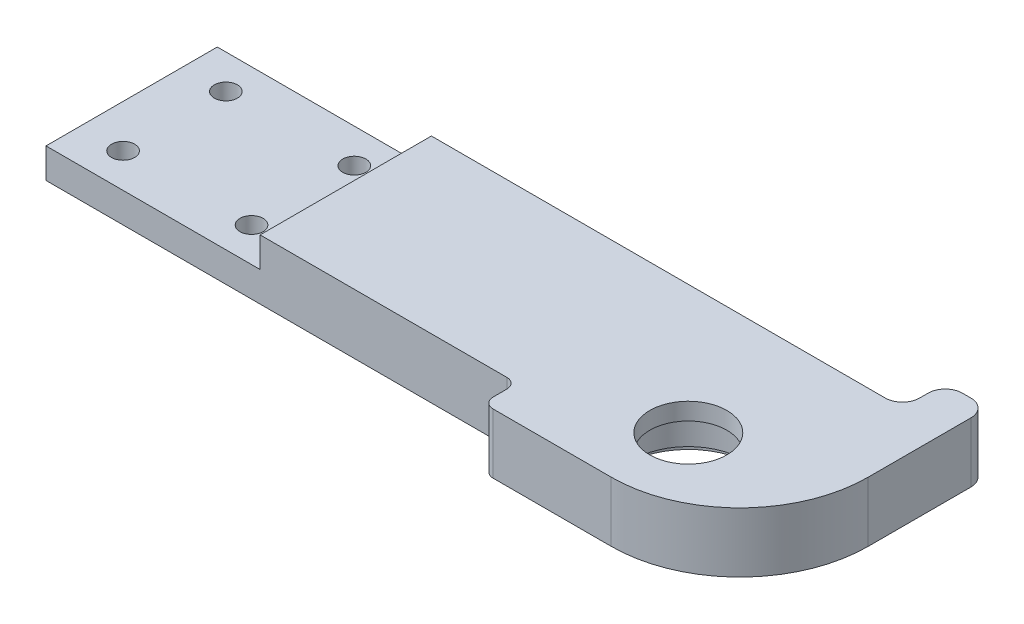
ISO-10303-21;
HEADER;
FILE_DESCRIPTION(('STEP AP214'),'2;1');
FILE_NAME('part.step','',(''),(''),'','','');
FILE_SCHEMA(('AUTOMOTIVE_DESIGN { 1 0 10303 214 1 1 1 1 }'));
ENDSEC;
DATA;
#1=APPLICATION_CONTEXT('core data for automotive mechanical design processes');
#2=APPLICATION_PROTOCOL_DEFINITION('international standard','automotive_design',2000,#1);
#3=PRODUCT_CONTEXT('',#1,'mechanical');
#4=PRODUCT('Part','Part','',(#3));
#5=PRODUCT_RELATED_PRODUCT_CATEGORY('part','',(#4));
#6=PRODUCT_DEFINITION_FORMATION('','',#4);
#7=PRODUCT_DEFINITION_CONTEXT('part definition',#1,'design');
#8=PRODUCT_DEFINITION('design','',#6,#7);
#9=PRODUCT_DEFINITION_SHAPE('','',#8);
#10=(LENGTH_UNIT() NAMED_UNIT(*) SI_UNIT(.MILLI.,.METRE.));
#11=(NAMED_UNIT(*) PLANE_ANGLE_UNIT() SI_UNIT($,.RADIAN.));
#12=(NAMED_UNIT(*) SI_UNIT($,.STERADIAN.) SOLID_ANGLE_UNIT());
#13=UNCERTAINTY_MEASURE_WITH_UNIT(LENGTH_MEASURE(1.E-05),#10,'distance_accuracy_value','');
#14=(GEOMETRIC_REPRESENTATION_CONTEXT(3) GLOBAL_UNCERTAINTY_ASSIGNED_CONTEXT((#13)) GLOBAL_UNIT_ASSIGNED_CONTEXT((#10,
#11,#12)) REPRESENTATION_CONTEXT('',''));
#15=CARTESIAN_POINT('',(0.,0.,0.));
#16=DIRECTION('',(0.,0.,1.));
#17=DIRECTION('',(1.,0.,0.));
#18=AXIS2_PLACEMENT_3D('',#15,#16,#17);
#19=CARTESIAN_POINT('',(0.,7.,-20.));
#20=DIRECTION('',(0.,0.,1.));
#21=DIRECTION('',(1.,0.,0.));
#22=AXIS2_PLACEMENT_3D('',#19,#20,#21);
#23=PLANE('',#22);
#24=DIRECTION('',(-1.,0.,0.));
#25=VECTOR('',#24,1.);
#26=CARTESIAN_POINT('',(0.,0.,-20.));
#27=LINE('',#26,#25);
#28=CARTESIAN_POINT('',(78.,0.,-20.));
#29=VERTEX_POINT('',#28);
#30=CARTESIAN_POINT('',(25.,0.,-20.));
#31=VERTEX_POINT('',#30);
#32=EDGE_CURVE('E151',#29,#31,#27,.T.);
#33=ORIENTED_EDGE('',*,*,#32,.F.);
#34=DIRECTION('',(0.,1.,0.));
#35=VECTOR('',#34,1.);
#36=CARTESIAN_POINT('',(78.,7.,-20.));
#37=LINE('',#36,#35);
#38=CARTESIAN_POINT('',(78.,-7.,-20.));
#39=VERTEX_POINT('',#38);
#40=EDGE_CURVE('E48',#29,#39,#37,.F.);
#41=ORIENTED_EDGE('',*,*,#40,.T.);
#42=DIRECTION('',(-1.,0.,0.));
#43=VECTOR('',#42,1.);
#44=CARTESIAN_POINT('',(0.,-7.,-20.));
#45=LINE('',#44,#43);
#46=CARTESIAN_POINT('',(0.,-7.,-20.));
#47=VERTEX_POINT('',#46);
#48=EDGE_CURVE('E245',#39,#47,#45,.T.);
#49=ORIENTED_EDGE('',*,*,#48,.T.);
#50=DIRECTION('',(0.,1.,0.));
#51=VECTOR('',#50,1.);
#52=CARTESIAN_POINT('',(0.,-7.,-20.));
#53=LINE('',#52,#51);
#54=CARTESIAN_POINT('',(0.,-3.5,-20.));
#55=VERTEX_POINT('',#54);
#56=EDGE_CURVE('E241',#47,#55,#53,.T.);
#57=ORIENTED_EDGE('',*,*,#56,.T.);
#58=DIRECTION('',(1.,0.,0.));
#59=VECTOR('',#58,1.);
#60=CARTESIAN_POINT('',(0.,-3.5,-20.));
#61=LINE('',#60,#59);
#62=CARTESIAN_POINT('',(25.,-3.5,-20.));
#63=VERTEX_POINT('',#62);
#64=EDGE_CURVE('E275',#55,#63,#61,.T.);
#65=ORIENTED_EDGE('',*,*,#64,.T.);
#66=DIRECTION('',(0.,-1.,0.));
#67=VECTOR('',#66,1.);
#68=CARTESIAN_POINT('',(25.,3.5,-20.));
#69=LINE('',#68,#67);
#70=EDGE_CURVE('E157',#31,#63,#69,.T.);
#71=ORIENTED_EDGE('',*,*,#70,.F.);
#72=EDGE_LOOP('',(#33,#41,#49,#57,#65,#71));
#73=FACE_BOUND('',#72,.T.);
#74=ADVANCED_FACE('F39',(#73),#23,.F.);
#75=CARTESIAN_POINT('',(70.,7.,-5.));
#76=DIRECTION('',(0.,-1.,0.));
#77=DIRECTION('',(0.,0.,-1.));
#78=AXIS2_PLACEMENT_3D('',#75,#76,#77);
#79=CYLINDRICAL_SURFACE('',#78,4.5);
#80=CARTESIAN_POINT('',(70.,-2.,-5.));
#81=DIRECTION('',(0.,1.,0.));
#82=DIRECTION('',(0.,0.,1.));
#83=AXIS2_PLACEMENT_3D('',#80,#81,#82);
#84=CIRCLE('',#83,4.5);
#85=CARTESIAN_POINT('',(70.,-2.,-0.499999999999995));
#86=VERTEX_POINT('',#85);
#87=EDGE_CURVE('E224',#86,#86,#84,.T.);
#88=ORIENTED_EDGE('',*,*,#87,.F.);
#89=EDGE_LOOP('',(#88));
#90=FACE_BOUND('',#89,.T.);
#91=CARTESIAN_POINT('',(70.,0.,-5.));
#92=DIRECTION('',(0.,1.,0.));
#93=DIRECTION('',(0.,0.,1.));
#94=AXIS2_PLACEMENT_3D('',#91,#92,#93);
#95=CIRCLE('',#94,4.5);
#96=CARTESIAN_POINT('',(70.,0.,-0.499999999999995));
#97=VERTEX_POINT('',#96);
#98=EDGE_CURVE('E332',#97,#97,#95,.T.);
#99=ORIENTED_EDGE('',*,*,#98,.T.);
#100=EDGE_LOOP('',(#99));
#101=FACE_BOUND('',#100,.T.);
#102=ADVANCED_FACE('F444',(#90,#101),#79,.F.);
#103=CARTESIAN_POINT('',(0.,7.,0.));
#104=DIRECTION('',(0.,0.,-1.));
#105=DIRECTION('',(-1.,0.,0.));
#106=AXIS2_PLACEMENT_3D('',#103,#104,#105);
#107=PLANE('',#106);
#108=DIRECTION('',(1.,0.,0.));
#109=VECTOR('',#108,1.);
#110=CARTESIAN_POINT('',(0.,0.,0.));
#111=LINE('',#110,#109);
#112=CARTESIAN_POINT('',(25.,0.,0.));
#113=VERTEX_POINT('',#112);
#114=CARTESIAN_POINT('',(53.8,0.,0.));
#115=VERTEX_POINT('',#114);
#116=EDGE_CURVE('E363',#113,#115,#111,.T.);
#117=ORIENTED_EDGE('',*,*,#116,.F.);
#118=DIRECTION('',(0.,-1.,0.));
#119=VECTOR('',#118,1.);
#120=CARTESIAN_POINT('',(25.,3.5,0.));
#121=LINE('',#120,#119);
#122=CARTESIAN_POINT('',(25.,-3.5,0.));
#123=VERTEX_POINT('',#122);
#124=EDGE_CURVE('E204',#113,#123,#121,.T.);
#125=ORIENTED_EDGE('',*,*,#124,.T.);
#126=DIRECTION('',(-1.,0.,0.));
#127=VECTOR('',#126,1.);
#128=CARTESIAN_POINT('',(0.,-3.5,0.));
#129=LINE('',#128,#127);
#130=CARTESIAN_POINT('',(0.,-3.5,0.));
#131=VERTEX_POINT('',#130);
#132=EDGE_CURVE('E268',#123,#131,#129,.T.);
#133=ORIENTED_EDGE('',*,*,#132,.T.);
#134=DIRECTION('',(0.,1.,0.));
#135=VECTOR('',#134,1.);
#136=CARTESIAN_POINT('',(0.,-7.,0.));
#137=LINE('',#136,#135);
#138=CARTESIAN_POINT('',(0.,-7.,0.));
#139=VERTEX_POINT('',#138);
#140=EDGE_CURVE('E237',#139,#131,#137,.T.);
#141=ORIENTED_EDGE('',*,*,#140,.F.);
#142=DIRECTION('',(1.,0.,0.));
#143=VECTOR('',#142,1.);
#144=CARTESIAN_POINT('',(0.,-7.,0.));
#145=LINE('',#144,#143);
#146=CARTESIAN_POINT('',(53.8,-7.,0.));
#147=VERTEX_POINT('',#146);
#148=EDGE_CURVE('E260',#139,#147,#145,.T.);
#149=ORIENTED_EDGE('',*,*,#148,.T.);
#150=DIRECTION('',(0.,-1.,0.));
#151=VECTOR('',#150,1.);
#152=CARTESIAN_POINT('',(53.8,7.,0.));
#153=LINE('',#152,#151);
#154=EDGE_CURVE('E190',#147,#115,#153,.F.);
#155=ORIENTED_EDGE('',*,*,#154,.T.);
#156=EDGE_LOOP('',(#117,#125,#133,#141,#149,#155));
#157=FACE_BOUND('',#156,.T.);
#158=ADVANCED_FACE('F404',(#157),#107,.F.);
#159=CARTESIAN_POINT('',(55.,7.,0.));
#160=DIRECTION('',(1.,0.,0.));
#161=DIRECTION('',(0.,0.,-1.));
#162=AXIS2_PLACEMENT_3D('',#159,#160,#161);
#163=PLANE('',#162);
#164=DIRECTION('',(0.,0.,1.));
#165=VECTOR('',#164,1.);
#166=CARTESIAN_POINT('',(55.,0.,0.));
#167=LINE('',#166,#165);
#168=CARTESIAN_POINT('',(55.,0.,1.2));
#169=VERTEX_POINT('',#168);
#170=CARTESIAN_POINT('',(55.,0.,2.8));
#171=VERTEX_POINT('',#170);
#172=EDGE_CURVE('E350',#169,#171,#167,.T.);
#173=ORIENTED_EDGE('',*,*,#172,.F.);
#174=DIRECTION('',(0.,-1.,0.));
#175=VECTOR('',#174,1.);
#176=CARTESIAN_POINT('',(55.,0.,1.2));
#177=LINE('',#176,#175);
#178=CARTESIAN_POINT('',(55.,-7.,1.2));
#179=VERTEX_POINT('',#178);
#180=EDGE_CURVE('E198',#169,#179,#177,.T.);
#181=ORIENTED_EDGE('',*,*,#180,.T.);
#182=DIRECTION('',(0.,0.,1.));
#183=VECTOR('',#182,1.);
#184=CARTESIAN_POINT('',(55.,-7.,0.));
#185=LINE('',#184,#183);
#186=CARTESIAN_POINT('',(55.,-7.,2.8));
#187=VERTEX_POINT('',#186);
#188=EDGE_CURVE('E256',#179,#187,#185,.T.);
#189=ORIENTED_EDGE('',*,*,#188,.T.);
#190=DIRECTION('',(0.,-1.,0.));
#191=VECTOR('',#190,1.);
#192=CARTESIAN_POINT('',(55.,7.,2.8));
#193=LINE('',#192,#191);
#194=EDGE_CURVE('E194',#187,#171,#193,.F.);
#195=ORIENTED_EDGE('',*,*,#194,.T.);
#196=EDGE_LOOP('',(#173,#181,#189,#195));
#197=FACE_BOUND('',#196,.T.);
#198=ADVANCED_FACE('F412',(#197),#163,.F.);
#199=CARTESIAN_POINT('',(85.,7.,4.));
#200=DIRECTION('',(0.,0.,-1.));
#201=DIRECTION('',(-1.,0.,0.));
#202=AXIS2_PLACEMENT_3D('',#199,#200,#201);
#203=PLANE('',#202);
#204=DIRECTION('',(1.,0.,0.));
#205=VECTOR('',#204,1.);
#206=CARTESIAN_POINT('',(85.,0.,4.));
#207=LINE('',#206,#205);
#208=CARTESIAN_POINT('',(56.2,0.,4.));
#209=VERTEX_POINT('',#208);
#210=CARTESIAN_POINT('',(70.,0.,4.));
#211=VERTEX_POINT('',#210);
#212=EDGE_CURVE('E339',#209,#211,#207,.T.);
#213=ORIENTED_EDGE('',*,*,#212,.F.);
#214=DIRECTION('',(0.,-1.,0.));
#215=VECTOR('',#214,1.);
#216=CARTESIAN_POINT('',(56.2,7.,4.));
#217=LINE('',#216,#215);
#218=CARTESIAN_POINT('',(56.2,-7.,4.));
#219=VERTEX_POINT('',#218);
#220=EDGE_CURVE('E201',#209,#219,#217,.T.);
#221=ORIENTED_EDGE('',*,*,#220,.T.);
#222=DIRECTION('',(1.,0.,0.));
#223=VECTOR('',#222,1.);
#224=CARTESIAN_POINT('',(85.,-7.,4.));
#225=LINE('',#224,#223);
#226=CARTESIAN_POINT('',(70.,-7.,4.));
#227=VERTEX_POINT('',#226);
#228=EDGE_CURVE('E252',#219,#227,#225,.T.);
#229=ORIENTED_EDGE('',*,*,#228,.T.);
#230=DIRECTION('',(0.,-1.,0.));
#231=VECTOR('',#230,1.);
#232=CARTESIAN_POINT('',(70.,7.,4.));
#233=LINE('',#232,#231);
#234=EDGE_CURVE('E183',#227,#211,#233,.F.);
#235=ORIENTED_EDGE('',*,*,#234,.T.);
#236=EDGE_LOOP('',(#213,#221,#229,#235));
#237=FACE_BOUND('',#236,.T.);
#238=ADVANCED_FACE('F420',(#237),#203,.F.);
#239=CARTESIAN_POINT('',(85.,7.,0.));
#240=DIRECTION('',(-1.,0.,0.));
#241=DIRECTION('',(0.,0.,1.));
#242=AXIS2_PLACEMENT_3D('',#239,#240,#241);
#243=PLANE('',#242);
#244=DIRECTION('',(0.,0.,-1.));
#245=VECTOR('',#244,1.);
#246=CARTESIAN_POINT('',(85.,0.,0.));
#247=LINE('',#246,#245);
#248=CARTESIAN_POINT('',(85.,0.,-11.));
#249=VERTEX_POINT('',#248);
#250=CARTESIAN_POINT('',(85.,0.,-23.));
#251=VERTEX_POINT('',#250);
#252=EDGE_CURVE('E353',#249,#251,#247,.T.);
#253=ORIENTED_EDGE('',*,*,#252,.F.);
#254=DIRECTION('',(0.,-1.,0.));
#255=VECTOR('',#254,1.);
#256=CARTESIAN_POINT('',(85.,7.,-11.));
#257=LINE('',#256,#255);
#258=CARTESIAN_POINT('',(85.,-7.,-11.));
#259=VERTEX_POINT('',#258);
#260=EDGE_CURVE('E187',#249,#259,#257,.T.);
#261=ORIENTED_EDGE('',*,*,#260,.T.);
#262=DIRECTION('',(0.,0.,-1.));
#263=VECTOR('',#262,1.);
#264=CARTESIAN_POINT('',(85.,-7.,0.));
#265=LINE('',#264,#263);
#266=CARTESIAN_POINT('',(85.,-7.,-23.));
#267=VERTEX_POINT('',#266);
#268=EDGE_CURVE('E248',#259,#267,#265,.T.);
#269=ORIENTED_EDGE('',*,*,#268,.T.);
#270=DIRECTION('',(0.,1.,0.));
#271=VECTOR('',#270,1.);
#272=CARTESIAN_POINT('',(85.,7.,-23.));
#273=LINE('',#272,#271);
#274=EDGE_CURVE('E179',#267,#251,#273,.T.);
#275=ORIENTED_EDGE('',*,*,#274,.T.);
#276=EDGE_LOOP('',(#253,#261,#269,#275));
#277=FACE_BOUND('',#276,.T.);
#278=ADVANCED_FACE('F427',(#277),#243,.F.);
#279=CARTESIAN_POINT('',(25.,3.5,0.));
#280=DIRECTION('',(1.,0.,0.));
#281=DIRECTION('',(0.,0.,-1.));
#282=AXIS2_PLACEMENT_3D('',#279,#280,#281);
#283=PLANE('',#282);
#284=DIRECTION('',(0.,0.,1.));
#285=VECTOR('',#284,1.);
#286=CARTESIAN_POINT('',(25.,0.,0.));
#287=LINE('',#286,#285);
#288=EDGE_CURVE('E366',#31,#113,#287,.T.);
#289=ORIENTED_EDGE('',*,*,#288,.F.);
#290=ORIENTED_EDGE('',*,*,#70,.T.);
#291=DIRECTION('',(0.,0.,1.));
#292=VECTOR('',#291,1.);
#293=CARTESIAN_POINT('',(25.,-3.5,0.));
#294=LINE('',#293,#292);
#295=EDGE_CURVE('E271',#63,#123,#294,.T.);
#296=ORIENTED_EDGE('',*,*,#295,.T.);
#297=ORIENTED_EDGE('',*,*,#124,.F.);
#298=EDGE_LOOP('',(#289,#290,#296,#297));
#299=FACE_BOUND('',#298,.T.);
#300=ADVANCED_FACE('F400',(#299),#283,.F.);
#301=CARTESIAN_POINT('',(56.2,7.,2.8));
#302=DIRECTION('',(0.,-1.,0.));
#303=DIRECTION('',(0.,0.,-1.));
#304=AXIS2_PLACEMENT_3D('',#301,#302,#303);
#305=CYLINDRICAL_SURFACE('',#304,1.2);
#306=ORIENTED_EDGE('',*,*,#220,.F.);
#307=CARTESIAN_POINT('',(56.2,0.,2.8));
#308=DIRECTION('',(0.,1.,0.));
#309=DIRECTION('',(0.,0.,1.));
#310=AXIS2_PLACEMENT_3D('',#307,#308,#309);
#311=CIRCLE('',#310,1.2);
#312=EDGE_CURVE('E342',#209,#171,#311,.F.);
#313=ORIENTED_EDGE('',*,*,#312,.T.);
#314=ORIENTED_EDGE('',*,*,#194,.F.);
#315=CARTESIAN_POINT('',(56.2,-7.,2.8));
#316=DIRECTION('',(0.,-1.,0.));
#317=DIRECTION('',(0.,0.,-1.));
#318=AXIS2_PLACEMENT_3D('',#315,#316,#317);
#319=CIRCLE('',#318,1.2);
#320=EDGE_CURVE('E233',#187,#219,#319,.F.);
#321=ORIENTED_EDGE('',*,*,#320,.T.);
#322=EDGE_LOOP('',(#306,#313,#314,#321));
#323=FACE_BOUND('',#322,.T.);
#324=ADVANCED_FACE('F416',(#323),#305,.T.);
#325=CARTESIAN_POINT('',(53.8,7.,1.2));
#326=DIRECTION('',(0.,1.,0.));
#327=DIRECTION('',(0.,0.,1.));
#328=AXIS2_PLACEMENT_3D('',#325,#326,#327);
#329=CYLINDRICAL_SURFACE('',#328,1.2);
#330=CARTESIAN_POINT('',(53.8,0.,1.2));
#331=DIRECTION('',(0.,1.,0.));
#332=DIRECTION('',(0.,0.,1.));
#333=AXIS2_PLACEMENT_3D('',#330,#331,#332);
#334=CIRCLE('',#333,1.2);
#335=EDGE_CURVE('E356',#115,#169,#334,.F.);
#336=ORIENTED_EDGE('',*,*,#335,.F.);
#337=ORIENTED_EDGE('',*,*,#154,.F.);
#338=CARTESIAN_POINT('',(53.8,-7.,1.2));
#339=DIRECTION('',(0.,-1.,0.));
#340=DIRECTION('',(0.,0.,-1.));
#341=AXIS2_PLACEMENT_3D('',#338,#339,#340);
#342=CIRCLE('',#341,1.2);
#343=EDGE_CURVE('E223',#147,#179,#342,.T.);
#344=ORIENTED_EDGE('',*,*,#343,.T.);
#345=ORIENTED_EDGE('',*,*,#180,.F.);
#346=EDGE_LOOP('',(#336,#337,#344,#345));
#347=FACE_BOUND('',#346,.T.);
#348=ADVANCED_FACE('F407',(#347),#329,.F.);
#349=CARTESIAN_POINT('',(70.,7.,-11.));
#350=DIRECTION('',(0.,-1.,0.));
#351=DIRECTION('',(0.,0.,-1.));
#352=AXIS2_PLACEMENT_3D('',#349,#350,#351);
#353=CYLINDRICAL_SURFACE('',#352,15.);
#354=ORIENTED_EDGE('',*,*,#260,.F.);
#355=CARTESIAN_POINT('',(70.,0.,-11.));
#356=DIRECTION('',(0.,1.,0.));
#357=DIRECTION('',(0.,0.,1.));
#358=AXIS2_PLACEMENT_3D('',#355,#356,#357);
#359=CIRCLE('',#358,15.);
#360=EDGE_CURVE('E346',#249,#211,#359,.F.);
#361=ORIENTED_EDGE('',*,*,#360,.T.);
#362=ORIENTED_EDGE('',*,*,#234,.F.);
#363=CARTESIAN_POINT('',(70.,-7.,-11.));
#364=DIRECTION('',(0.,-1.,0.));
#365=DIRECTION('',(0.,0.,-1.));
#366=AXIS2_PLACEMENT_3D('',#363,#364,#365);
#367=CIRCLE('',#366,15.);
#368=EDGE_CURVE('E219',#227,#259,#367,.F.);
#369=ORIENTED_EDGE('',*,*,#368,.T.);
#370=EDGE_LOOP('',(#354,#361,#362,#369));
#371=FACE_BOUND('',#370,.T.);
#372=ADVANCED_FACE('F424',(#371),#353,.T.);
#373=CARTESIAN_POINT('',(85.,-7.07106781186548,-25.));
#374=DIRECTION('',(0.,0.,-1.));
#375=DIRECTION('',(-1.,0.,0.));
#376=AXIS2_PLACEMENT_3D('',#373,#374,#375);
#377=PLANE('',#376);
#378=DIRECTION('',(0.,1.,0.));
#379=VECTOR('',#378,1.);
#380=CARTESIAN_POINT('',(82.,-7.07106781186548,-25.));
#381=LINE('',#380,#379);
#382=CARTESIAN_POINT('',(82.,-7.,-25.));
#383=VERTEX_POINT('',#382);
#384=CARTESIAN_POINT('',(82.,0.,-25.));
#385=VERTEX_POINT('',#384);
#386=EDGE_CURVE('E175',#383,#385,#381,.T.);
#387=ORIENTED_EDGE('',*,*,#386,.T.);
#388=DIRECTION('',(1.,0.,0.));
#389=VECTOR('',#388,1.);
#390=CARTESIAN_POINT('',(85.,0.,-25.));
#391=LINE('',#390,#389);
#392=CARTESIAN_POINT('',(83.,0.,-25.));
#393=VERTEX_POINT('',#392);
#394=EDGE_CURVE('E369',#385,#393,#391,.T.);
#395=ORIENTED_EDGE('',*,*,#394,.T.);
#396=DIRECTION('',(0.,1.,0.));
#397=VECTOR('',#396,1.);
#398=CARTESIAN_POINT('',(83.,0.,-25.));
#399=LINE('',#398,#397);
#400=CARTESIAN_POINT('',(83.,-7.,-25.));
#401=VERTEX_POINT('',#400);
#402=EDGE_CURVE('E172',#393,#401,#399,.F.);
#403=ORIENTED_EDGE('',*,*,#402,.T.);
#404=DIRECTION('',(-1.,0.,0.));
#405=VECTOR('',#404,1.);
#406=CARTESIAN_POINT('',(85.,-7.,-25.));
#407=LINE('',#406,#405);
#408=EDGE_CURVE('E328',#401,#383,#407,.T.);
#409=ORIENTED_EDGE('',*,*,#408,.T.);
#410=EDGE_LOOP('',(#387,#395,#403,#409));
#411=FACE_BOUND('',#410,.T.);
#412=ADVANCED_FACE('F433',(#411),#377,.T.);
#413=CARTESIAN_POINT('',(80.,-7.07106781186548,-20.));
#414=DIRECTION('',(-1.,0.,0.));
#415=DIRECTION('',(0.,0.,1.));
#416=AXIS2_PLACEMENT_3D('',#413,#414,#415);
#417=PLANE('',#416);
#418=DIRECTION('',(0.,1.,0.));
#419=VECTOR('',#418,1.);
#420=CARTESIAN_POINT('',(80.,-7.07106781186548,-22.));
#421=LINE('',#420,#419);
#422=CARTESIAN_POINT('',(80.,-7.,-22.));
#423=VERTEX_POINT('',#422);
#424=CARTESIAN_POINT('',(80.,0.,-22.));
#425=VERTEX_POINT('',#424);
#426=EDGE_CURVE('E167',#423,#425,#421,.T.);
#427=ORIENTED_EDGE('',*,*,#426,.T.);
#428=DIRECTION('',(0.,0.,-1.));
#429=VECTOR('',#428,1.);
#430=CARTESIAN_POINT('',(80.,0.,-20.));
#431=LINE('',#430,#429);
#432=CARTESIAN_POINT('',(80.,0.,-23.));
#433=VERTEX_POINT('',#432);
#434=EDGE_CURVE('E54',#425,#433,#431,.T.);
#435=ORIENTED_EDGE('',*,*,#434,.T.);
#436=DIRECTION('',(0.,1.,0.));
#437=VECTOR('',#436,1.);
#438=CARTESIAN_POINT('',(80.,-7.07106781186548,-23.));
#439=LINE('',#438,#437);
#440=CARTESIAN_POINT('',(80.,-7.,-23.));
#441=VERTEX_POINT('',#440);
#442=EDGE_CURVE('E165',#433,#441,#439,.F.);
#443=ORIENTED_EDGE('',*,*,#442,.T.);
#444=DIRECTION('',(0.,0.,1.));
#445=VECTOR('',#444,1.);
#446=CARTESIAN_POINT('',(80.,-7.,-20.));
#447=LINE('',#446,#445);
#448=EDGE_CURVE('E324',#441,#423,#447,.T.);
#449=ORIENTED_EDGE('',*,*,#448,.T.);
#450=EDGE_LOOP('',(#427,#435,#443,#449));
#451=FACE_BOUND('',#450,.T.);
#452=ADVANCED_FACE('F379',(#451),#417,.T.);
#453=CARTESIAN_POINT('',(83.,7.,-23.));
#454=DIRECTION('',(0.,-1.,0.));
#455=DIRECTION('',(0.,0.,-1.));
#456=AXIS2_PLACEMENT_3D('',#453,#454,#455);
#457=CYLINDRICAL_SURFACE('',#456,2.);
#458=ORIENTED_EDGE('',*,*,#402,.F.);
#459=CARTESIAN_POINT('',(83.,0.,-23.));
#460=DIRECTION('',(0.,1.,0.));
#461=DIRECTION('',(0.,0.,1.));
#462=AXIS2_PLACEMENT_3D('',#459,#460,#461);
#463=CIRCLE('',#462,2.);
#464=EDGE_CURVE('E359',#393,#251,#463,.F.);
#465=ORIENTED_EDGE('',*,*,#464,.T.);
#466=ORIENTED_EDGE('',*,*,#274,.F.);
#467=CARTESIAN_POINT('',(83.,-7.,-23.));
#468=DIRECTION('',(0.,-1.,0.));
#469=DIRECTION('',(0.,0.,-1.));
#470=AXIS2_PLACEMENT_3D('',#467,#468,#469);
#471=CIRCLE('',#470,2.);
#472=EDGE_CURVE('E211',#267,#401,#471,.F.);
#473=ORIENTED_EDGE('',*,*,#472,.T.);
#474=EDGE_LOOP('',(#458,#465,#466,#473));
#475=FACE_BOUND('',#474,.T.);
#476=ADVANCED_FACE('F431',(#475),#457,.T.);
#477=CARTESIAN_POINT('',(82.,-7.07106781186548,-23.));
#478=DIRECTION('',(0.,1.,0.));
#479=DIRECTION('',(0.,0.,1.));
#480=AXIS2_PLACEMENT_3D('',#477,#478,#479);
#481=CYLINDRICAL_SURFACE('',#480,2.);
#482=ORIENTED_EDGE('',*,*,#442,.F.);
#483=CARTESIAN_POINT('',(82.,0.,-23.));
#484=DIRECTION('',(0.,1.,0.));
#485=DIRECTION('',(0.,0.,1.));
#486=AXIS2_PLACEMENT_3D('',#483,#484,#485);
#487=CIRCLE('',#486,2.);
#488=EDGE_CURVE('E159',#433,#385,#487,.F.);
#489=ORIENTED_EDGE('',*,*,#488,.T.);
#490=ORIENTED_EDGE('',*,*,#386,.F.);
#491=CARTESIAN_POINT('',(82.,-7.,-23.));
#492=DIRECTION('',(0.,-1.,0.));
#493=DIRECTION('',(0.,0.,-1.));
#494=AXIS2_PLACEMENT_3D('',#491,#492,#493);
#495=CIRCLE('',#494,2.);
#496=EDGE_CURVE('E215',#383,#441,#495,.F.);
#497=ORIENTED_EDGE('',*,*,#496,.T.);
#498=EDGE_LOOP('',(#482,#489,#490,#497));
#499=FACE_BOUND('',#498,.T.);
#500=ADVANCED_FACE('F381',(#499),#481,.T.);
#501=CARTESIAN_POINT('',(78.,-7.07106781186548,-22.));
#502=DIRECTION('',(0.,1.,0.));
#503=DIRECTION('',(0.,0.,1.));
#504=AXIS2_PLACEMENT_3D('',#501,#502,#503);
#505=CYLINDRICAL_SURFACE('',#504,2.);
#506=CARTESIAN_POINT('',(78.,0.,-22.));
#507=DIRECTION('',(0.,1.,0.));
#508=DIRECTION('',(0.,0.,1.));
#509=AXIS2_PLACEMENT_3D('',#506,#507,#508);
#510=CIRCLE('',#509,2.);
#511=EDGE_CURVE('E11',#425,#29,#510,.F.);
#512=ORIENTED_EDGE('',*,*,#511,.F.);
#513=ORIENTED_EDGE('',*,*,#426,.F.);
#514=CARTESIAN_POINT('',(78.,-7.,-22.));
#515=DIRECTION('',(0.,-1.,0.));
#516=DIRECTION('',(0.,0.,-1.));
#517=AXIS2_PLACEMENT_3D('',#514,#515,#516);
#518=CIRCLE('',#517,2.);
#519=EDGE_CURVE('E162',#423,#39,#518,.T.);
#520=ORIENTED_EDGE('',*,*,#519,.T.);
#521=ORIENTED_EDGE('',*,*,#40,.F.);
#522=EDGE_LOOP('',(#512,#513,#520,#521));
#523=FACE_BOUND('',#522,.T.);
#524=ADVANCED_FACE('F41',(#523),#505,.F.);
#525=CARTESIAN_POINT('',(0.,-7.,0.));
#526=DIRECTION('',(1.,0.,0.));
#527=DIRECTION('',(0.,0.,-1.));
#528=AXIS2_PLACEMENT_3D('',#525,#526,#527);
#529=PLANE('',#528);
#530=DIRECTION('',(0.,0.,-1.));
#531=VECTOR('',#530,1.);
#532=CARTESIAN_POINT('',(0.,-3.5,0.));
#533=LINE('',#532,#531);
#534=EDGE_CURVE('E278',#131,#55,#533,.T.);
#535=ORIENTED_EDGE('',*,*,#534,.T.);
#536=ORIENTED_EDGE('',*,*,#56,.F.);
#537=DIRECTION('',(0.,0.,1.));
#538=VECTOR('',#537,1.);
#539=CARTESIAN_POINT('',(0.,-7.,0.));
#540=LINE('',#539,#538);
#541=EDGE_CURVE('E264',#47,#139,#540,.T.);
#542=ORIENTED_EDGE('',*,*,#541,.T.);
#543=ORIENTED_EDGE('',*,*,#140,.T.);
#544=EDGE_LOOP('',(#535,#536,#542,#543));
#545=FACE_BOUND('',#544,.T.);
#546=ADVANCED_FACE('F391',(#545),#529,.F.);
#547=CARTESIAN_POINT('',(0.,-7.,0.));
#548=DIRECTION('',(0.,1.,0.));
#549=DIRECTION('',(0.,0.,-1.));
#550=AXIS2_PLACEMENT_3D('',#547,#548,#549);
#551=PLANE('',#550);
#552=CARTESIAN_POINT('',(70.,-7.,-5.));
#553=DIRECTION('',(0.,1.,0.));
#554=DIRECTION('',(0.,0.,1.));
#555=AXIS2_PLACEMENT_3D('',#552,#553,#554);
#556=CIRCLE('',#555,7.5);
#557=CARTESIAN_POINT('',(70.,-7.,2.5));
#558=VERTEX_POINT('',#557);
#559=EDGE_CURVE('E228',#558,#558,#556,.T.);
#560=ORIENTED_EDGE('',*,*,#559,.T.);
#561=EDGE_LOOP('',(#560));
#562=FACE_BOUND('',#561,.T.);
#563=CARTESIAN_POINT('',(5.,-7.,-16.));
#564=DIRECTION('',(0.,-1.,0.));
#565=DIRECTION('',(0.,0.,-1.));
#566=AXIS2_PLACEMENT_3D('',#563,#564,#565);
#567=CIRCLE('',#566,1.35);
#568=CARTESIAN_POINT('',(5.,-7.,-17.35));
#569=VERTEX_POINT('',#568);
#570=EDGE_CURVE('E281',#569,#569,#567,.T.);
#571=ORIENTED_EDGE('',*,*,#570,.F.);
#572=EDGE_LOOP('',(#571));
#573=FACE_BOUND('',#572,.T.);
#574=CARTESIAN_POINT('',(20.,-7.,-16.));
#575=DIRECTION('',(0.,-1.,0.));
#576=DIRECTION('',(0.,0.,-1.));
#577=AXIS2_PLACEMENT_3D('',#574,#575,#576);
#578=CIRCLE('',#577,1.35);
#579=CARTESIAN_POINT('',(20.,-7.,-17.35));
#580=VERTEX_POINT('',#579);
#581=EDGE_CURVE('E285',#580,#580,#578,.T.);
#582=ORIENTED_EDGE('',*,*,#581,.F.);
#583=EDGE_LOOP('',(#582));
#584=FACE_BOUND('',#583,.T.);
#585=CARTESIAN_POINT('',(20.,-7.,-4.));
#586=DIRECTION('',(0.,-1.,0.));
#587=DIRECTION('',(0.,0.,-1.));
#588=AXIS2_PLACEMENT_3D('',#585,#586,#587);
#589=CIRCLE('',#588,1.35);
#590=CARTESIAN_POINT('',(20.,-7.,-5.35));
#591=VERTEX_POINT('',#590);
#592=EDGE_CURVE('E289',#591,#591,#589,.T.);
#593=ORIENTED_EDGE('',*,*,#592,.F.);
#594=EDGE_LOOP('',(#593));
#595=FACE_BOUND('',#594,.T.);
#596=CARTESIAN_POINT('',(5.,-7.,-4.));
#597=DIRECTION('',(0.,-1.,0.));
#598=DIRECTION('',(0.,0.,-1.));
#599=AXIS2_PLACEMENT_3D('',#596,#597,#598);
#600=CIRCLE('',#599,1.35);
#601=CARTESIAN_POINT('',(5.,-7.,-5.35));
#602=VERTEX_POINT('',#601);
#603=EDGE_CURVE('E293',#602,#602,#600,.T.);
#604=ORIENTED_EDGE('',*,*,#603,.F.);
#605=EDGE_LOOP('',(#604));
#606=FACE_BOUND('',#605,.T.);
#607=ORIENTED_EDGE('',*,*,#268,.F.);
#608=ORIENTED_EDGE('',*,*,#368,.F.);
#609=ORIENTED_EDGE('',*,*,#228,.F.);
#610=ORIENTED_EDGE('',*,*,#320,.F.);
#611=ORIENTED_EDGE('',*,*,#188,.F.);
#612=ORIENTED_EDGE('',*,*,#343,.F.);
#613=ORIENTED_EDGE('',*,*,#148,.F.);
#614=ORIENTED_EDGE('',*,*,#541,.F.);
#615=ORIENTED_EDGE('',*,*,#48,.F.);
#616=ORIENTED_EDGE('',*,*,#519,.F.);
#617=ORIENTED_EDGE('',*,*,#448,.F.);
#618=ORIENTED_EDGE('',*,*,#496,.F.);
#619=ORIENTED_EDGE('',*,*,#408,.F.);
#620=ORIENTED_EDGE('',*,*,#472,.F.);
#621=EDGE_LOOP('',(#607,#608,#609,#610,#611,#612,#613,#614,#615,#616,#617,#618,#619,#620));
#622=FACE_BOUND('',#621,.T.);
#623=ADVANCED_FACE('F387',(#562,#573,#584,#595,#606,#622),#551,.F.);
#624=CARTESIAN_POINT('',(0.,-3.5,0.));
#625=DIRECTION('',(0.,1.,0.));
#626=DIRECTION('',(0.,0.,-1.));
#627=AXIS2_PLACEMENT_3D('',#624,#625,#626);
#628=PLANE('',#627);
#629=CARTESIAN_POINT('',(5.,-3.5,-16.));
#630=DIRECTION('',(0.,-1.,0.));
#631=DIRECTION('',(0.,0.,-1.));
#632=AXIS2_PLACEMENT_3D('',#629,#630,#631);
#633=CIRCLE('',#632,1.35);
#634=CARTESIAN_POINT('',(5.,-3.5,-17.35));
#635=VERTEX_POINT('',#634);
#636=EDGE_CURVE('E302',#635,#635,#633,.T.);
#637=ORIENTED_EDGE('',*,*,#636,.T.);
#638=EDGE_LOOP('',(#637));
#639=FACE_BOUND('',#638,.T.);
#640=CARTESIAN_POINT('',(20.,-3.5,-16.));
#641=DIRECTION('',(0.,-1.,0.));
#642=DIRECTION('',(0.,0.,-1.));
#643=AXIS2_PLACEMENT_3D('',#640,#641,#642);
#644=CIRCLE('',#643,1.35);
#645=CARTESIAN_POINT('',(20.,-3.5,-17.35));
#646=VERTEX_POINT('',#645);
#647=EDGE_CURVE('E306',#646,#646,#644,.T.);
#648=ORIENTED_EDGE('',*,*,#647,.T.);
#649=EDGE_LOOP('',(#648));
#650=FACE_BOUND('',#649,.T.);
#651=CARTESIAN_POINT('',(20.,-3.5,-4.));
#652=DIRECTION('',(0.,-1.,0.));
#653=DIRECTION('',(0.,0.,-1.));
#654=AXIS2_PLACEMENT_3D('',#651,#652,#653);
#655=CIRCLE('',#654,1.35);
#656=CARTESIAN_POINT('',(20.,-3.5,-5.35));
#657=VERTEX_POINT('',#656);
#658=EDGE_CURVE('E301',#657,#657,#655,.T.);
#659=ORIENTED_EDGE('',*,*,#658,.T.);
#660=EDGE_LOOP('',(#659));
#661=FACE_BOUND('',#660,.T.);
#662=CARTESIAN_POINT('',(5.,-3.5,-4.));
#663=DIRECTION('',(0.,-1.,0.));
#664=DIRECTION('',(0.,0.,-1.));
#665=AXIS2_PLACEMENT_3D('',#662,#663,#664);
#666=CIRCLE('',#665,1.35);
#667=CARTESIAN_POINT('',(5.,-3.5,-5.35));
#668=VERTEX_POINT('',#667);
#669=EDGE_CURVE('E297',#668,#668,#666,.T.);
#670=ORIENTED_EDGE('',*,*,#669,.T.);
#671=EDGE_LOOP('',(#670));
#672=FACE_BOUND('',#671,.T.);
#673=ORIENTED_EDGE('',*,*,#534,.F.);
#674=ORIENTED_EDGE('',*,*,#132,.F.);
#675=ORIENTED_EDGE('',*,*,#295,.F.);
#676=ORIENTED_EDGE('',*,*,#64,.F.);
#677=EDGE_LOOP('',(#673,#674,#675,#676));
#678=FACE_BOUND('',#677,.T.);
#679=ADVANCED_FACE('F397',(#639,#650,#661,#672,#678),#628,.T.);
#680=CARTESIAN_POINT('',(5.,-17.5,-4.));
#681=DIRECTION('',(0.,1.,0.));
#682=DIRECTION('',(0.,0.,-1.));
#683=AXIS2_PLACEMENT_3D('',#680,#681,#682);
#684=CYLINDRICAL_SURFACE('',#683,1.35);
#685=ORIENTED_EDGE('',*,*,#669,.F.);
#686=EDGE_LOOP('',(#685));
#687=FACE_BOUND('',#686,.T.);
#688=ORIENTED_EDGE('',*,*,#603,.T.);
#689=EDGE_LOOP('',(#688));
#690=FACE_BOUND('',#689,.T.);
#691=ADVANCED_FACE('F481',(#687,#690),#684,.F.);
#692=CARTESIAN_POINT('',(20.,-17.5,-4.));
#693=DIRECTION('',(0.,1.,0.));
#694=DIRECTION('',(0.,0.,-1.));
#695=AXIS2_PLACEMENT_3D('',#692,#693,#694);
#696=CYLINDRICAL_SURFACE('',#695,1.35);
#697=ORIENTED_EDGE('',*,*,#658,.F.);
#698=EDGE_LOOP('',(#697));
#699=FACE_BOUND('',#698,.T.);
#700=ORIENTED_EDGE('',*,*,#592,.T.);
#701=EDGE_LOOP('',(#700));
#702=FACE_BOUND('',#701,.T.);
#703=ADVANCED_FACE('F485',(#699,#702),#696,.F.);
#704=CARTESIAN_POINT('',(20.,-17.5,-16.));
#705=DIRECTION('',(0.,1.,0.));
#706=DIRECTION('',(0.,0.,-1.));
#707=AXIS2_PLACEMENT_3D('',#704,#705,#706);
#708=CYLINDRICAL_SURFACE('',#707,1.35);
#709=ORIENTED_EDGE('',*,*,#647,.F.);
#710=EDGE_LOOP('',(#709));
#711=FACE_BOUND('',#710,.T.);
#712=ORIENTED_EDGE('',*,*,#581,.T.);
#713=EDGE_LOOP('',(#712));
#714=FACE_BOUND('',#713,.T.);
#715=ADVANCED_FACE('F491',(#711,#714),#708,.F.);
#716=CARTESIAN_POINT('',(5.,-17.5,-16.));
#717=DIRECTION('',(0.,1.,0.));
#718=DIRECTION('',(0.,0.,-1.));
#719=AXIS2_PLACEMENT_3D('',#716,#717,#718);
#720=CYLINDRICAL_SURFACE('',#719,1.35);
#721=ORIENTED_EDGE('',*,*,#636,.F.);
#722=EDGE_LOOP('',(#721));
#723=FACE_BOUND('',#722,.T.);
#724=ORIENTED_EDGE('',*,*,#570,.T.);
#725=EDGE_LOOP('',(#724));
#726=FACE_BOUND('',#725,.T.);
#727=ADVANCED_FACE('F487',(#723,#726),#720,.F.);
#728=CARTESIAN_POINT('',(70.,-6.,-5.));
#729=DIRECTION('',(0.,-1.,0.));
#730=DIRECTION('',(0.,0.,1.));
#731=AXIS2_PLACEMENT_3D('',#728,#729,#730);
#732=CYLINDRICAL_SURFACE('',#731,7.5);
#733=CARTESIAN_POINT('',(70.,-6.,-5.));
#734=DIRECTION('',(0.,1.,0.));
#735=DIRECTION('',(0.,0.,1.));
#736=AXIS2_PLACEMENT_3D('',#733,#734,#735);
#737=CIRCLE('',#736,7.5);
#738=CARTESIAN_POINT('',(70.,-6.,2.5));
#739=VERTEX_POINT('',#738);
#740=EDGE_CURVE('E307',#739,#739,#737,.T.);
#741=ORIENTED_EDGE('',*,*,#740,.T.);
#742=EDGE_LOOP('',(#741));
#743=FACE_BOUND('',#742,.T.);
#744=ORIENTED_EDGE('',*,*,#559,.F.);
#745=EDGE_LOOP('',(#744));
#746=FACE_BOUND('',#745,.T.);
#747=ADVANCED_FACE('F490',(#743,#746),#732,.F.);
#748=CARTESIAN_POINT('',(70.,-6.,-5.));
#749=DIRECTION('',(0.,-1.,0.));
#750=DIRECTION('',(0.,0.,1.));
#751=AXIS2_PLACEMENT_3D('',#748,#749,#750);
#752=PLANE('',#751);
#753=CARTESIAN_POINT('',(70.,-6.,-5.));
#754=DIRECTION('',(0.,1.,0.));
#755=DIRECTION('',(0.,0.,1.));
#756=AXIS2_PLACEMENT_3D('',#753,#754,#755);
#757=CIRCLE('',#756,6.5);
#758=CARTESIAN_POINT('',(70.,-6.,1.5));
#759=VERTEX_POINT('',#758);
#760=EDGE_CURVE('E320',#759,#759,#757,.T.);
#761=ORIENTED_EDGE('',*,*,#760,.T.);
#762=EDGE_LOOP('',(#761));
#763=FACE_BOUND('',#762,.T.);
#764=ORIENTED_EDGE('',*,*,#740,.F.);
#765=EDGE_LOOP('',(#764));
#766=FACE_BOUND('',#765,.T.);
#767=ADVANCED_FACE('F501',(#763,#766),#752,.T.);
#768=CARTESIAN_POINT('',(70.,-2.,-5.));
#769=DIRECTION('',(0.,-1.,0.));
#770=DIRECTION('',(0.,0.,1.));
#771=AXIS2_PLACEMENT_3D('',#768,#769,#770);
#772=CYLINDRICAL_SURFACE('',#771,6.5);
#773=CARTESIAN_POINT('',(70.,-2.,-5.));
#774=DIRECTION('',(0.,1.,0.));
#775=DIRECTION('',(0.,0.,1.));
#776=AXIS2_PLACEMENT_3D('',#773,#774,#775);
#777=CIRCLE('',#776,6.5);
#778=CARTESIAN_POINT('',(70.,-2.,1.5));
#779=VERTEX_POINT('',#778);
#780=EDGE_CURVE('E229',#779,#779,#777,.T.);
#781=ORIENTED_EDGE('',*,*,#780,.T.);
#782=EDGE_LOOP('',(#781));
#783=FACE_BOUND('',#782,.T.);
#784=ORIENTED_EDGE('',*,*,#760,.F.);
#785=EDGE_LOOP('',(#784));
#786=FACE_BOUND('',#785,.T.);
#787=ADVANCED_FACE('F505',(#783,#786),#772,.F.);
#788=CARTESIAN_POINT('',(70.,-2.,-5.));
#789=DIRECTION('',(0.,-1.,0.));
#790=DIRECTION('',(0.,0.,1.));
#791=AXIS2_PLACEMENT_3D('',#788,#789,#790);
#792=PLANE('',#791);
#793=ORIENTED_EDGE('',*,*,#87,.T.);
#794=EDGE_LOOP('',(#793));
#795=FACE_BOUND('',#794,.T.);
#796=ORIENTED_EDGE('',*,*,#780,.F.);
#797=EDGE_LOOP('',(#796));
#798=FACE_BOUND('',#797,.T.);
#799=ADVANCED_FACE('F509',(#795,#798),#792,.T.);
#800=CARTESIAN_POINT('',(0.,0.,0.));
#801=DIRECTION('',(0.,1.,0.));
#802=DIRECTION('',(0.,0.,1.));
#803=AXIS2_PLACEMENT_3D('',#800,#801,#802);
#804=PLANE('',#803);
#805=ORIENTED_EDGE('',*,*,#98,.F.);
#806=EDGE_LOOP('',(#805));
#807=FACE_BOUND('',#806,.T.);
#808=ORIENTED_EDGE('',*,*,#212,.T.);
#809=ORIENTED_EDGE('',*,*,#360,.F.);
#810=ORIENTED_EDGE('',*,*,#252,.T.);
#811=ORIENTED_EDGE('',*,*,#464,.F.);
#812=ORIENTED_EDGE('',*,*,#394,.F.);
#813=ORIENTED_EDGE('',*,*,#488,.F.);
#814=ORIENTED_EDGE('',*,*,#434,.F.);
#815=ORIENTED_EDGE('',*,*,#511,.T.);
#816=ORIENTED_EDGE('',*,*,#32,.T.);
#817=ORIENTED_EDGE('',*,*,#288,.T.);
#818=ORIENTED_EDGE('',*,*,#116,.T.);
#819=ORIENTED_EDGE('',*,*,#335,.T.);
#820=ORIENTED_EDGE('',*,*,#172,.T.);
#821=ORIENTED_EDGE('',*,*,#312,.F.);
#822=EDGE_LOOP('',(#808,#809,#810,#811,#812,#813,#814,#815,#816,#817,#818,#819,#820,#821));
#823=FACE_BOUND('',#822,.T.);
#824=ADVANCED_FACE('F150',(#807,#823),#804,.T.);
#825=CLOSED_SHELL('',(#74,#102,#158,#198,#238,#278,#300,#324,#348,#372,#412,#452,#476,#500,#524,
#546,#623,#679,#691,#703,#715,#727,#747,#767,#787,#799,#824));
#826=MANIFOLD_SOLID_BREP('B2',#825);
#827=ADVANCED_BREP_SHAPE_REPRESENTATION('',(#18,#826),#14);
#828=SHAPE_DEFINITION_REPRESENTATION(#9,#827);
ENDSEC;
END-ISO-10303-21;
